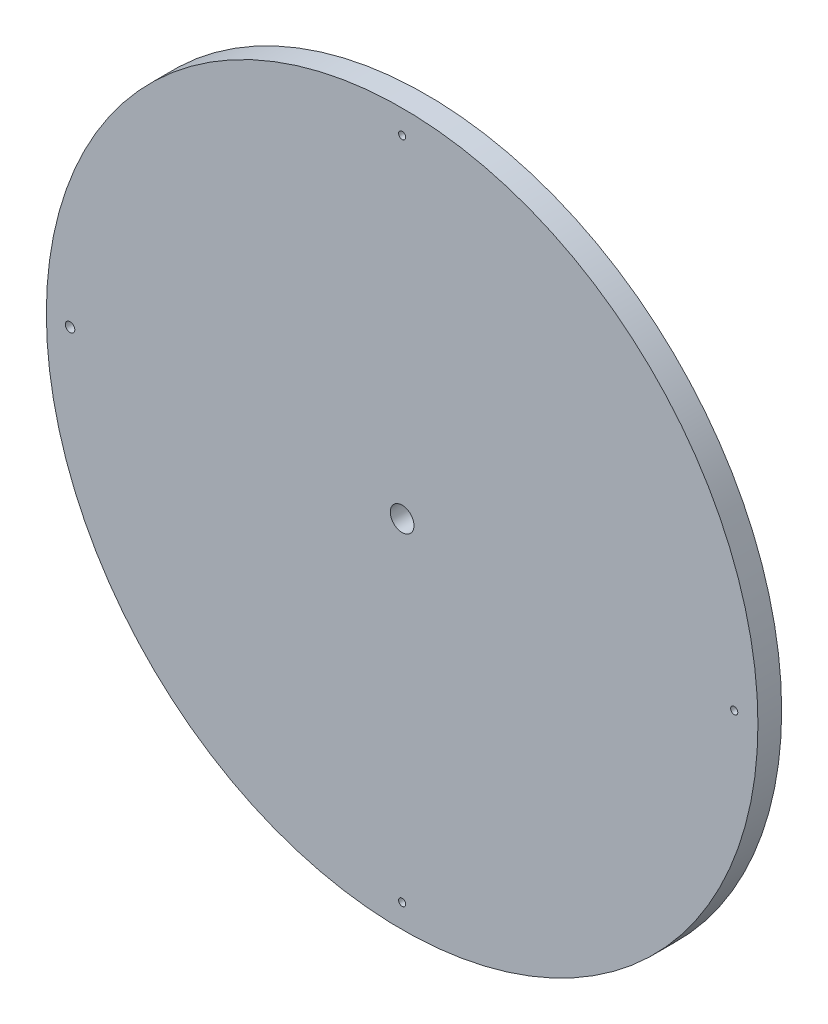
ISO-10303-21;
HEADER;
FILE_DESCRIPTION(('STEP AP214'),'2;1');
FILE_NAME('part.step','',(''),(''),'','','');
FILE_SCHEMA(('AUTOMOTIVE_DESIGN { 1 0 10303 214 1 1 1 1 }'));
ENDSEC;
DATA;
#1=APPLICATION_CONTEXT('core data for automotive mechanical design processes');
#2=APPLICATION_PROTOCOL_DEFINITION('international standard','automotive_design',2000,#1);
#3=PRODUCT_CONTEXT('',#1,'mechanical');
#4=PRODUCT('Part','Part','',(#3));
#5=PRODUCT_RELATED_PRODUCT_CATEGORY('part','',(#4));
#6=PRODUCT_DEFINITION_FORMATION('','',#4);
#7=PRODUCT_DEFINITION_CONTEXT('part definition',#1,'design');
#8=PRODUCT_DEFINITION('design','',#6,#7);
#9=PRODUCT_DEFINITION_SHAPE('','',#8);
#10=(LENGTH_UNIT() NAMED_UNIT(*) SI_UNIT(.MILLI.,.METRE.));
#11=(NAMED_UNIT(*) PLANE_ANGLE_UNIT() SI_UNIT($,.RADIAN.));
#12=(NAMED_UNIT(*) SI_UNIT($,.STERADIAN.) SOLID_ANGLE_UNIT());
#13=UNCERTAINTY_MEASURE_WITH_UNIT(LENGTH_MEASURE(1.E-05),#10,'distance_accuracy_value','');
#14=(GEOMETRIC_REPRESENTATION_CONTEXT(3) GLOBAL_UNCERTAINTY_ASSIGNED_CONTEXT((#13)) GLOBAL_UNIT_ASSIGNED_CONTEXT((#10,
#11,#12)) REPRESENTATION_CONTEXT('',''));
#15=CARTESIAN_POINT('',(0.,0.,0.));
#16=DIRECTION('',(0.,0.,1.));
#17=DIRECTION('',(1.,0.,0.));
#18=AXIS2_PLACEMENT_3D('',#15,#16,#17);
#19=CARTESIAN_POINT('',(0.,0.,10.));
#20=DIRECTION('',(0.,0.,-1.));
#21=DIRECTION('',(-1.,0.,0.));
#22=AXIS2_PLACEMENT_3D('',#19,#20,#21);
#23=CYLINDRICAL_SURFACE('',#22,150.);
#24=CARTESIAN_POINT('',(0.,0.,10.));
#25=DIRECTION('',(0.,0.,1.));
#26=DIRECTION('',(1.,0.,0.));
#27=AXIS2_PLACEMENT_3D('',#24,#25,#26);
#28=CIRCLE('',#27,150.);
#29=CARTESIAN_POINT('',(150.,0.,10.));
#30=VERTEX_POINT('',#29);
#31=EDGE_CURVE('E10',#30,#30,#28,.T.);
#32=ORIENTED_EDGE('',*,*,#31,.F.);
#33=EDGE_LOOP('',(#32));
#34=FACE_BOUND('',#33,.T.);
#35=CARTESIAN_POINT('',(0.,0.,0.));
#36=DIRECTION('',(0.,0.,1.));
#37=DIRECTION('',(1.,0.,0.));
#38=AXIS2_PLACEMENT_3D('',#35,#36,#37);
#39=CIRCLE('',#38,150.);
#40=CARTESIAN_POINT('',(150.,0.,0.));
#41=VERTEX_POINT('',#40);
#42=EDGE_CURVE('E34',#41,#41,#39,.T.);
#43=ORIENTED_EDGE('',*,*,#42,.T.);
#44=EDGE_LOOP('',(#43));
#45=FACE_BOUND('',#44,.T.);
#46=ADVANCED_FACE('F31',(#34,#45),#23,.T.);
#47=CARTESIAN_POINT('',(0.,0.,10.));
#48=DIRECTION('',(0.,0.,1.));
#49=DIRECTION('',(1.,0.,0.));
#50=AXIS2_PLACEMENT_3D('',#47,#48,#49);
#51=PLANE('',#50);
#52=CARTESIAN_POINT('',(0.,0.,10.));
#53=DIRECTION('',(0.,0.,1.));
#54=DIRECTION('',(1.,0.,0.));
#55=AXIS2_PLACEMENT_3D('',#52,#53,#54);
#56=CIRCLE('',#55,5.);
#57=CARTESIAN_POINT('',(5.,0.,10.));
#58=VERTEX_POINT('',#57);
#59=EDGE_CURVE('E67',#58,#58,#56,.T.);
#60=ORIENTED_EDGE('',*,*,#59,.F.);
#61=EDGE_LOOP('',(#60));
#62=FACE_BOUND('',#61,.T.);
#63=CARTESIAN_POINT('',(0.,-140.,10.));
#64=DIRECTION('',(0.,0.,1.));
#65=DIRECTION('',(1.,0.,0.));
#66=AXIS2_PLACEMENT_3D('',#63,#64,#65);
#67=CIRCLE('',#66,1.5);
#68=CARTESIAN_POINT('',(1.50000000000003,-140.,10.));
#69=VERTEX_POINT('',#68);
#70=EDGE_CURVE('E62',#69,#69,#67,.T.);
#71=ORIENTED_EDGE('',*,*,#70,.F.);
#72=EDGE_LOOP('',(#71));
#73=FACE_BOUND('',#72,.T.);
#74=CARTESIAN_POINT('',(-140.,0.,10.));
#75=DIRECTION('',(0.,0.,1.));
#76=DIRECTION('',(1.,0.,0.));
#77=AXIS2_PLACEMENT_3D('',#74,#75,#76);
#78=CIRCLE('',#77,2.);
#79=CARTESIAN_POINT('',(-138.,0.,10.));
#80=VERTEX_POINT('',#79);
#81=EDGE_CURVE('E59',#80,#80,#78,.T.);
#82=ORIENTED_EDGE('',*,*,#81,.F.);
#83=EDGE_LOOP('',(#82));
#84=FACE_BOUND('',#83,.T.);
#85=CARTESIAN_POINT('',(140.,0.,10.));
#86=DIRECTION('',(0.,0.,1.));
#87=DIRECTION('',(1.,0.,0.));
#88=AXIS2_PLACEMENT_3D('',#85,#86,#87);
#89=CIRCLE('',#88,1.5);
#90=CARTESIAN_POINT('',(141.5,0.,10.));
#91=VERTEX_POINT('',#90);
#92=EDGE_CURVE('E52',#91,#91,#89,.T.);
#93=ORIENTED_EDGE('',*,*,#92,.F.);
#94=EDGE_LOOP('',(#93));
#95=FACE_BOUND('',#94,.T.);
#96=CARTESIAN_POINT('',(0.,140.,10.));
#97=DIRECTION('',(0.,0.,1.));
#98=DIRECTION('',(1.,0.,0.));
#99=AXIS2_PLACEMENT_3D('',#96,#97,#98);
#100=CIRCLE('',#99,1.5);
#101=CARTESIAN_POINT('',(1.5,140.,10.));
#102=VERTEX_POINT('',#101);
#103=EDGE_CURVE('E43',#102,#102,#100,.T.);
#104=ORIENTED_EDGE('',*,*,#103,.F.);
#105=EDGE_LOOP('',(#104));
#106=FACE_BOUND('',#105,.T.);
#107=ORIENTED_EDGE('',*,*,#31,.T.);
#108=EDGE_LOOP('',(#107));
#109=FACE_BOUND('',#108,.T.);
#110=ADVANCED_FACE('F83',(#62,#73,#84,#95,#106,#109),#51,.T.);
#111=CARTESIAN_POINT('',(0.,0.,0.));
#112=DIRECTION('',(0.,0.,1.));
#113=DIRECTION('',(1.,0.,0.));
#114=AXIS2_PLACEMENT_3D('',#111,#112,#113);
#115=PLANE('',#114);
#116=CARTESIAN_POINT('',(0.,0.,0.));
#117=DIRECTION('',(0.,0.,1.));
#118=DIRECTION('',(1.,0.,0.));
#119=AXIS2_PLACEMENT_3D('',#116,#117,#118);
#120=CIRCLE('',#119,5.);
#121=CARTESIAN_POINT('',(5.,0.,0.));
#122=VERTEX_POINT('',#121);
#123=EDGE_CURVE('E53',#122,#122,#120,.T.);
#124=ORIENTED_EDGE('',*,*,#123,.T.);
#125=EDGE_LOOP('',(#124));
#126=FACE_BOUND('',#125,.T.);
#127=CARTESIAN_POINT('',(0.,-140.,0.));
#128=DIRECTION('',(0.,0.,1.));
#129=DIRECTION('',(1.,0.,0.));
#130=AXIS2_PLACEMENT_3D('',#127,#128,#129);
#131=CIRCLE('',#130,1.5);
#132=CARTESIAN_POINT('',(1.50000000000003,-140.,0.));
#133=VERTEX_POINT('',#132);
#134=EDGE_CURVE('E46',#133,#133,#131,.T.);
#135=ORIENTED_EDGE('',*,*,#134,.T.);
#136=EDGE_LOOP('',(#135));
#137=FACE_BOUND('',#136,.T.);
#138=CARTESIAN_POINT('',(-140.,0.,0.));
#139=DIRECTION('',(0.,0.,1.));
#140=DIRECTION('',(1.,0.,0.));
#141=AXIS2_PLACEMENT_3D('',#138,#139,#140);
#142=CIRCLE('',#141,2.);
#143=CARTESIAN_POINT('',(-138.,0.,0.));
#144=VERTEX_POINT('',#143);
#145=EDGE_CURVE('E56',#144,#144,#142,.T.);
#146=ORIENTED_EDGE('',*,*,#145,.T.);
#147=EDGE_LOOP('',(#146));
#148=FACE_BOUND('',#147,.T.);
#149=CARTESIAN_POINT('',(140.,0.,0.));
#150=DIRECTION('',(0.,0.,1.));
#151=DIRECTION('',(1.,0.,0.));
#152=AXIS2_PLACEMENT_3D('',#149,#150,#151);
#153=CIRCLE('',#152,1.5);
#154=CARTESIAN_POINT('',(141.5,0.,0.));
#155=VERTEX_POINT('',#154);
#156=EDGE_CURVE('E49',#155,#155,#153,.T.);
#157=ORIENTED_EDGE('',*,*,#156,.T.);
#158=EDGE_LOOP('',(#157));
#159=FACE_BOUND('',#158,.T.);
#160=CARTESIAN_POINT('',(0.,140.,0.));
#161=DIRECTION('',(0.,0.,1.));
#162=DIRECTION('',(1.,0.,0.));
#163=AXIS2_PLACEMENT_3D('',#160,#161,#162);
#164=CIRCLE('',#163,1.5);
#165=CARTESIAN_POINT('',(1.5,140.,0.));
#166=VERTEX_POINT('',#165);
#167=EDGE_CURVE('E41',#166,#166,#164,.T.);
#168=ORIENTED_EDGE('',*,*,#167,.T.);
#169=EDGE_LOOP('',(#168));
#170=FACE_BOUND('',#169,.T.);
#171=ORIENTED_EDGE('',*,*,#42,.F.);
#172=EDGE_LOOP('',(#171));
#173=FACE_BOUND('',#172,.T.);
#174=ADVANCED_FACE('F73',(#126,#137,#148,#159,#170,#173),#115,.F.);
#175=CARTESIAN_POINT('',(0.,140.,0.));
#176=DIRECTION('',(0.,0.,1.));
#177=DIRECTION('',(1.,0.,0.));
#178=AXIS2_PLACEMENT_3D('',#175,#176,#177);
#179=CYLINDRICAL_SURFACE('',#178,1.5);
#180=ORIENTED_EDGE('',*,*,#167,.F.);
#181=EDGE_LOOP('',(#180));
#182=FACE_BOUND('',#181,.T.);
#183=ORIENTED_EDGE('',*,*,#103,.T.);
#184=EDGE_LOOP('',(#183));
#185=FACE_BOUND('',#184,.T.);
#186=ADVANCED_FACE('F95',(#182,#185),#179,.F.);
#187=CARTESIAN_POINT('',(140.,0.,0.));
#188=DIRECTION('',(0.,0.,1.));
#189=DIRECTION('',(1.,0.,0.));
#190=AXIS2_PLACEMENT_3D('',#187,#188,#189);
#191=CYLINDRICAL_SURFACE('',#190,1.5);
#192=ORIENTED_EDGE('',*,*,#156,.F.);
#193=EDGE_LOOP('',(#192));
#194=FACE_BOUND('',#193,.T.);
#195=ORIENTED_EDGE('',*,*,#92,.T.);
#196=EDGE_LOOP('',(#195));
#197=FACE_BOUND('',#196,.T.);
#198=ADVANCED_FACE('F97',(#194,#197),#191,.F.);
#199=CARTESIAN_POINT('',(-140.,0.,0.));
#200=DIRECTION('',(0.,0.,1.));
#201=DIRECTION('',(1.,0.,0.));
#202=AXIS2_PLACEMENT_3D('',#199,#200,#201);
#203=CYLINDRICAL_SURFACE('',#202,2.);
#204=ORIENTED_EDGE('',*,*,#145,.F.);
#205=EDGE_LOOP('',(#204));
#206=FACE_BOUND('',#205,.T.);
#207=ORIENTED_EDGE('',*,*,#81,.T.);
#208=EDGE_LOOP('',(#207));
#209=FACE_BOUND('',#208,.T.);
#210=ADVANCED_FACE('F104',(#206,#209),#203,.F.);
#211=CARTESIAN_POINT('',(0.,-140.,0.));
#212=DIRECTION('',(0.,0.,1.));
#213=DIRECTION('',(1.,0.,0.));
#214=AXIS2_PLACEMENT_3D('',#211,#212,#213);
#215=CYLINDRICAL_SURFACE('',#214,1.5);
#216=ORIENTED_EDGE('',*,*,#134,.F.);
#217=EDGE_LOOP('',(#216));
#218=FACE_BOUND('',#217,.T.);
#219=ORIENTED_EDGE('',*,*,#70,.T.);
#220=EDGE_LOOP('',(#219));
#221=FACE_BOUND('',#220,.T.);
#222=ADVANCED_FACE('F79',(#218,#221),#215,.F.);
#223=CARTESIAN_POINT('',(0.,0.,0.));
#224=DIRECTION('',(0.,0.,1.));
#225=DIRECTION('',(1.,0.,0.));
#226=AXIS2_PLACEMENT_3D('',#223,#224,#225);
#227=CYLINDRICAL_SURFACE('',#226,5.);
#228=ORIENTED_EDGE('',*,*,#123,.F.);
#229=EDGE_LOOP('',(#228));
#230=FACE_BOUND('',#229,.T.);
#231=ORIENTED_EDGE('',*,*,#59,.T.);
#232=EDGE_LOOP('',(#231));
#233=FACE_BOUND('',#232,.T.);
#234=ADVANCED_FACE('F76',(#230,#233),#227,.F.);
#235=CLOSED_SHELL('',(#46,#110,#174,#186,#198,#210,#222,#234));
#236=MANIFOLD_SOLID_BREP('B2',#235);
#237=ADVANCED_BREP_SHAPE_REPRESENTATION('',(#18,#236),#14);
#238=SHAPE_DEFINITION_REPRESENTATION(#9,#237);
ENDSEC;
END-ISO-10303-21;
